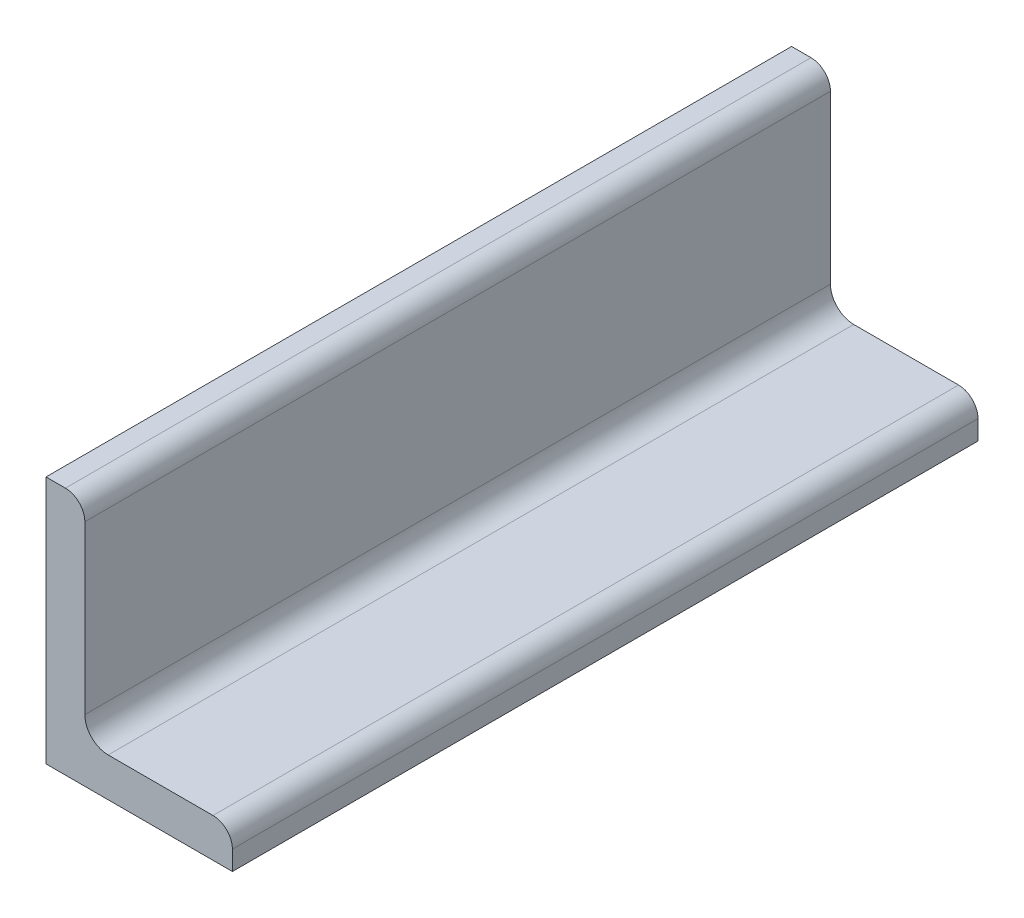
ISO-10303-21;
HEADER;
FILE_DESCRIPTION(('STEP AP214'),'2;1');
FILE_NAME('part.step','',(''),(''),'','','');
FILE_SCHEMA(('AUTOMOTIVE_DESIGN { 1 0 10303 214 1 1 1 1 }'));
ENDSEC;
DATA;
#1=APPLICATION_CONTEXT('core data for automotive mechanical design processes');
#2=APPLICATION_PROTOCOL_DEFINITION('international standard','automotive_design',2000,#1);
#3=PRODUCT_CONTEXT('',#1,'mechanical');
#4=PRODUCT('Part','Part','',(#3));
#5=PRODUCT_RELATED_PRODUCT_CATEGORY('part','',(#4));
#6=PRODUCT_DEFINITION_FORMATION('','',#4);
#7=PRODUCT_DEFINITION_CONTEXT('part definition',#1,'design');
#8=PRODUCT_DEFINITION('design','',#6,#7);
#9=PRODUCT_DEFINITION_SHAPE('','',#8);
#10=(LENGTH_UNIT() NAMED_UNIT(*) SI_UNIT(.MILLI.,.METRE.));
#11=(NAMED_UNIT(*) PLANE_ANGLE_UNIT() SI_UNIT($,.RADIAN.));
#12=(NAMED_UNIT(*) SI_UNIT($,.STERADIAN.) SOLID_ANGLE_UNIT());
#13=UNCERTAINTY_MEASURE_WITH_UNIT(LENGTH_MEASURE(1.E-05),#10,'distance_accuracy_value','');
#14=(GEOMETRIC_REPRESENTATION_CONTEXT(3) GLOBAL_UNCERTAINTY_ASSIGNED_CONTEXT((#13)) GLOBAL_UNIT_ASSIGNED_CONTEXT((#10,
#11,#12)) REPRESENTATION_CONTEXT('',''));
#15=CARTESIAN_POINT('',(0.,0.,0.));
#16=DIRECTION('',(0.,0.,1.));
#17=DIRECTION('',(1.,0.,0.));
#18=AXIS2_PLACEMENT_3D('',#15,#16,#17);
#19=CARTESIAN_POINT('',(0.490776827053332,102.172018782971,304.8));
#20=DIRECTION('',(1.,0.,0.));
#21=DIRECTION('',(0.,0.,-1.));
#22=AXIS2_PLACEMENT_3D('',#19,#20,#21);
#23=PLANE('',#22);
#24=DIRECTION('',(0.,-1.,0.));
#25=VECTOR('',#24,1.);
#26=CARTESIAN_POINT('',(0.490776827053332,102.172018782971,0.));
#27=LINE('',#26,#25);
#28=CARTESIAN_POINT('',(0.490776827053332,102.172018782971,0.));
#29=VERTEX_POINT('',#28);
#30=CARTESIAN_POINT('',(0.490776827053332,0.572018782971054,0.));
#31=VERTEX_POINT('',#30);
#32=EDGE_CURVE('E135',#29,#31,#27,.T.);
#33=ORIENTED_EDGE('',*,*,#32,.T.);
#34=DIRECTION('',(0.,0.,-1.));
#35=VECTOR('',#34,1.);
#36=CARTESIAN_POINT('',(0.490776827053332,0.572018782971054,304.8));
#37=LINE('',#36,#35);
#38=CARTESIAN_POINT('',(0.490776827053332,0.572018782971054,304.8));
#39=VERTEX_POINT('',#38);
#40=EDGE_CURVE('E11',#39,#31,#37,.T.);
#41=ORIENTED_EDGE('',*,*,#40,.F.);
#42=DIRECTION('',(0.,-1.,0.));
#43=VECTOR('',#42,1.);
#44=CARTESIAN_POINT('',(0.490776827053332,102.172018782971,304.8));
#45=LINE('',#44,#43);
#46=CARTESIAN_POINT('',(0.490776827053332,102.172018782971,304.8));
#47=VERTEX_POINT('',#46);
#48=EDGE_CURVE('E151',#47,#39,#45,.T.);
#49=ORIENTED_EDGE('',*,*,#48,.F.);
#50=DIRECTION('',(0.,0.,-1.));
#51=VECTOR('',#50,1.);
#52=CARTESIAN_POINT('',(0.490776827053332,102.172018782971,304.8));
#53=LINE('',#52,#51);
#54=EDGE_CURVE('E131',#47,#29,#53,.T.);
#55=ORIENTED_EDGE('',*,*,#54,.T.);
#56=EDGE_LOOP('',(#33,#41,#49,#55));
#57=FACE_BOUND('',#56,.T.);
#58=ADVANCED_FACE('F33',(#57),#23,.F.);
#59=CARTESIAN_POINT('',(0.490776827053332,0.572018782971054,304.8));
#60=DIRECTION('',(0.,1.,0.));
#61=DIRECTION('',(0.,0.,1.));
#62=AXIS2_PLACEMENT_3D('',#59,#60,#61);
#63=PLANE('',#62);
#64=DIRECTION('',(1.,0.,0.));
#65=VECTOR('',#64,1.);
#66=CARTESIAN_POINT('',(0.490776827053332,0.572018782971054,0.));
#67=LINE('',#66,#65);
#68=CARTESIAN_POINT('',(76.6907768270533,0.572018782971054,0.));
#69=VERTEX_POINT('',#68);
#70=EDGE_CURVE('E138',#31,#69,#67,.T.);
#71=ORIENTED_EDGE('',*,*,#70,.T.);
#72=DIRECTION('',(0.,0.,-1.));
#73=VECTOR('',#72,1.);
#74=CARTESIAN_POINT('',(76.6907768270533,0.572018782971054,304.8));
#75=LINE('',#74,#73);
#76=CARTESIAN_POINT('',(76.6907768270533,0.572018782971054,304.8));
#77=VERTEX_POINT('',#76);
#78=EDGE_CURVE('E41',#77,#69,#75,.T.);
#79=ORIENTED_EDGE('',*,*,#78,.F.);
#80=DIRECTION('',(1.,0.,0.));
#81=VECTOR('',#80,1.);
#82=CARTESIAN_POINT('',(0.490776827053332,0.572018782971054,304.8));
#83=LINE('',#82,#81);
#84=EDGE_CURVE('E95',#39,#77,#83,.T.);
#85=ORIENTED_EDGE('',*,*,#84,.F.);
#86=ORIENTED_EDGE('',*,*,#40,.T.);
#87=EDGE_LOOP('',(#71,#79,#85,#86));
#88=FACE_BOUND('',#87,.T.);
#89=ADVANCED_FACE('F194',(#88),#63,.F.);
#90=CARTESIAN_POINT('',(76.6907768270533,0.572018782971054,304.8));
#91=DIRECTION('',(-1.,0.,0.));
#92=DIRECTION('',(0.,0.,1.));
#93=AXIS2_PLACEMENT_3D('',#90,#91,#92);
#94=PLANE('',#93);
#95=DIRECTION('',(0.,1.,0.));
#96=VECTOR('',#95,1.);
#97=CARTESIAN_POINT('',(76.6907768270533,0.572018782971054,0.));
#98=LINE('',#97,#96);
#99=CARTESIAN_POINT('',(76.6907768270533,8.50951878297105,0.));
#100=VERTEX_POINT('',#99);
#101=EDGE_CURVE('E140',#69,#100,#98,.T.);
#102=ORIENTED_EDGE('',*,*,#101,.T.);
#103=DIRECTION('',(0.,0.,-1.));
#104=VECTOR('',#103,1.);
#105=CARTESIAN_POINT('',(76.6907768270533,8.50951878297105,304.8));
#106=LINE('',#105,#104);
#107=CARTESIAN_POINT('',(76.6907768270533,8.50951878297105,304.8));
#108=VERTEX_POINT('',#107);
#109=EDGE_CURVE('E161',#108,#100,#106,.T.);
#110=ORIENTED_EDGE('',*,*,#109,.F.);
#111=DIRECTION('',(0.,1.,0.));
#112=VECTOR('',#111,1.);
#113=CARTESIAN_POINT('',(76.6907768270533,0.572018782971054,304.8));
#114=LINE('',#113,#112);
#115=EDGE_CURVE('E169',#77,#108,#114,.T.);
#116=ORIENTED_EDGE('',*,*,#115,.F.);
#117=ORIENTED_EDGE('',*,*,#78,.T.);
#118=EDGE_LOOP('',(#102,#110,#116,#117));
#119=FACE_BOUND('',#118,.T.);
#120=ADVANCED_FACE('F167',(#119),#94,.F.);
#121=CARTESIAN_POINT('',(68.7532768270533,8.50951878297105,304.8));
#122=DIRECTION('',(0.,0.,-1.));
#123=DIRECTION('',(-1.,0.,0.));
#124=AXIS2_PLACEMENT_3D('',#121,#122,#123);
#125=CYLINDRICAL_SURFACE('',#124,7.9375);
#126=CARTESIAN_POINT('',(68.7532768270533,8.50951878297105,0.));
#127=DIRECTION('',(0.,0.,1.));
#128=DIRECTION('',(1.,0.,0.));
#129=AXIS2_PLACEMENT_3D('',#126,#127,#128);
#130=CIRCLE('',#129,7.9375);
#131=CARTESIAN_POINT('',(68.7532768270533,16.447018782971,0.));
#132=VERTEX_POINT('',#131);
#133=EDGE_CURVE('E142',#100,#132,#130,.T.);
#134=ORIENTED_EDGE('',*,*,#133,.T.);
#135=DIRECTION('',(0.,0.,-1.));
#136=VECTOR('',#135,1.);
#137=CARTESIAN_POINT('',(68.7532768270533,16.447018782971,304.8));
#138=LINE('',#137,#136);
#139=CARTESIAN_POINT('',(68.7532768270533,16.447018782971,304.8));
#140=VERTEX_POINT('',#139);
#141=EDGE_CURVE('E158',#140,#132,#138,.T.);
#142=ORIENTED_EDGE('',*,*,#141,.F.);
#143=CARTESIAN_POINT('',(68.7532768270533,8.50951878297105,304.8));
#144=DIRECTION('',(0.,0.,1.));
#145=DIRECTION('',(1.,0.,0.));
#146=AXIS2_PLACEMENT_3D('',#143,#144,#145);
#147=CIRCLE('',#146,7.9375);
#148=EDGE_CURVE('E185',#108,#140,#147,.T.);
#149=ORIENTED_EDGE('',*,*,#148,.F.);
#150=ORIENTED_EDGE('',*,*,#109,.T.);
#151=EDGE_LOOP('',(#134,#142,#149,#150));
#152=FACE_BOUND('',#151,.T.);
#153=ADVANCED_FACE('F178',(#152),#125,.T.);
#154=CARTESIAN_POINT('',(68.7532768270533,16.4470187829711,304.8));
#155=DIRECTION('',(0.,-1.,0.));
#156=DIRECTION('',(0.,0.,-1.));
#157=AXIS2_PLACEMENT_3D('',#154,#155,#156);
#158=PLANE('',#157);
#159=DIRECTION('',(-1.,0.,0.));
#160=VECTOR('',#159,1.);
#161=CARTESIAN_POINT('',(68.7532768270533,16.4470187829711,0.));
#162=LINE('',#161,#160);
#163=CARTESIAN_POINT('',(25.8907768270533,16.4470187829711,0.));
#164=VERTEX_POINT('',#163);
#165=EDGE_CURVE('E144',#132,#164,#162,.T.);
#166=ORIENTED_EDGE('',*,*,#165,.T.);
#167=DIRECTION('',(0.,0.,-1.));
#168=VECTOR('',#167,1.);
#169=CARTESIAN_POINT('',(25.8907768270533,16.4470187829711,304.8));
#170=LINE('',#169,#168);
#171=CARTESIAN_POINT('',(25.8907768270533,16.4470187829711,304.8));
#172=VERTEX_POINT('',#171);
#173=EDGE_CURVE('E155',#172,#164,#170,.T.);
#174=ORIENTED_EDGE('',*,*,#173,.F.);
#175=DIRECTION('',(-1.,0.,0.));
#176=VECTOR('',#175,1.);
#177=CARTESIAN_POINT('',(68.7532768270533,16.4470187829711,304.8));
#178=LINE('',#177,#176);
#179=EDGE_CURVE('E184',#140,#172,#178,.T.);
#180=ORIENTED_EDGE('',*,*,#179,.F.);
#181=ORIENTED_EDGE('',*,*,#141,.T.);
#182=EDGE_LOOP('',(#166,#174,#180,#181));
#183=FACE_BOUND('',#182,.T.);
#184=ADVANCED_FACE('F182',(#183),#158,.F.);
#185=CARTESIAN_POINT('',(25.8907768270533,25.972018782971,304.8));
#186=DIRECTION('',(0.,0.,-1.));
#187=DIRECTION('',(-1.,0.,0.));
#188=AXIS2_PLACEMENT_3D('',#185,#186,#187);
#189=CYLINDRICAL_SURFACE('',#188,9.52499999999999);
#190=CARTESIAN_POINT('',(25.8907768270533,25.972018782971,0.));
#191=DIRECTION('',(0.,0.,-1.));
#192=DIRECTION('',(1.,0.,0.));
#193=AXIS2_PLACEMENT_3D('',#190,#191,#192);
#194=CIRCLE('',#193,9.52499999999999);
#195=CARTESIAN_POINT('',(16.3657768270533,25.9720187829711,0.));
#196=VERTEX_POINT('',#195);
#197=EDGE_CURVE('E146',#164,#196,#194,.T.);
#198=ORIENTED_EDGE('',*,*,#197,.T.);
#199=DIRECTION('',(0.,0.,-1.));
#200=VECTOR('',#199,1.);
#201=CARTESIAN_POINT('',(16.3657768270533,25.9720187829711,304.8));
#202=LINE('',#201,#200);
#203=CARTESIAN_POINT('',(16.3657768270533,25.9720187829711,304.8));
#204=VERTEX_POINT('',#203);
#205=EDGE_CURVE('E126',#204,#196,#202,.T.);
#206=ORIENTED_EDGE('',*,*,#205,.F.);
#207=CARTESIAN_POINT('',(25.8907768270533,25.972018782971,304.8));
#208=DIRECTION('',(0.,0.,-1.));
#209=DIRECTION('',(1.,0.,0.));
#210=AXIS2_PLACEMENT_3D('',#207,#208,#209);
#211=CIRCLE('',#210,9.52499999999999);
#212=EDGE_CURVE('E117',#172,#204,#211,.T.);
#213=ORIENTED_EDGE('',*,*,#212,.F.);
#214=ORIENTED_EDGE('',*,*,#173,.T.);
#215=EDGE_LOOP('',(#198,#206,#213,#214));
#216=FACE_BOUND('',#215,.T.);
#217=ADVANCED_FACE('F206',(#216),#189,.F.);
#218=CARTESIAN_POINT('',(16.3657768270533,25.9720187829711,304.8));
#219=DIRECTION('',(-1.,0.,0.));
#220=DIRECTION('',(0.,0.,1.));
#221=AXIS2_PLACEMENT_3D('',#218,#219,#220);
#222=PLANE('',#221);
#223=DIRECTION('',(0.,1.,0.));
#224=VECTOR('',#223,1.);
#225=CARTESIAN_POINT('',(16.3657768270533,25.9720187829711,0.));
#226=LINE('',#225,#224);
#227=CARTESIAN_POINT('',(16.3657768270533,94.2345187829711,0.));
#228=VERTEX_POINT('',#227);
#229=EDGE_CURVE('E125',#196,#228,#226,.T.);
#230=ORIENTED_EDGE('',*,*,#229,.T.);
#231=DIRECTION('',(0.,0.,-1.));
#232=VECTOR('',#231,1.);
#233=CARTESIAN_POINT('',(16.3657768270533,94.2345187829711,304.8));
#234=LINE('',#233,#232);
#235=CARTESIAN_POINT('',(16.3657768270533,94.2345187829711,304.8));
#236=VERTEX_POINT('',#235);
#237=EDGE_CURVE('E122',#236,#228,#234,.T.);
#238=ORIENTED_EDGE('',*,*,#237,.F.);
#239=DIRECTION('',(0.,1.,0.));
#240=VECTOR('',#239,1.);
#241=CARTESIAN_POINT('',(16.3657768270533,25.9720187829711,304.8));
#242=LINE('',#241,#240);
#243=EDGE_CURVE('E111',#204,#236,#242,.T.);
#244=ORIENTED_EDGE('',*,*,#243,.F.);
#245=ORIENTED_EDGE('',*,*,#205,.T.);
#246=EDGE_LOOP('',(#230,#238,#244,#245));
#247=FACE_BOUND('',#246,.T.);
#248=ADVANCED_FACE('F123',(#247),#222,.F.);
#249=CARTESIAN_POINT('',(8.42827682705334,94.234518782971,304.8));
#250=DIRECTION('',(0.,0.,-1.));
#251=DIRECTION('',(-1.,0.,0.));
#252=AXIS2_PLACEMENT_3D('',#249,#250,#251);
#253=CYLINDRICAL_SURFACE('',#252,7.9375);
#254=CARTESIAN_POINT('',(8.42827682705334,94.234518782971,0.));
#255=DIRECTION('',(0.,0.,1.));
#256=DIRECTION('',(1.,0.,0.));
#257=AXIS2_PLACEMENT_3D('',#254,#255,#256);
#258=CIRCLE('',#257,7.9375);
#259=CARTESIAN_POINT('',(8.42827682705333,102.172018782971,0.));
#260=VERTEX_POINT('',#259);
#261=EDGE_CURVE('E81',#228,#260,#258,.T.);
#262=ORIENTED_EDGE('',*,*,#261,.T.);
#263=DIRECTION('',(0.,0.,-1.));
#264=VECTOR('',#263,1.);
#265=CARTESIAN_POINT('',(8.42827682705333,102.172018782971,304.8));
#266=LINE('',#265,#264);
#267=CARTESIAN_POINT('',(8.42827682705333,102.172018782971,304.8));
#268=VERTEX_POINT('',#267);
#269=EDGE_CURVE('E127',#268,#260,#266,.T.);
#270=ORIENTED_EDGE('',*,*,#269,.F.);
#271=CARTESIAN_POINT('',(8.42827682705334,94.234518782971,304.8));
#272=DIRECTION('',(0.,0.,1.));
#273=DIRECTION('',(1.,0.,0.));
#274=AXIS2_PLACEMENT_3D('',#271,#272,#273);
#275=CIRCLE('',#274,7.9375);
#276=EDGE_CURVE('E115',#236,#268,#275,.T.);
#277=ORIENTED_EDGE('',*,*,#276,.F.);
#278=ORIENTED_EDGE('',*,*,#237,.T.);
#279=EDGE_LOOP('',(#262,#270,#277,#278));
#280=FACE_BOUND('',#279,.T.);
#281=ADVANCED_FACE('F129',(#280),#253,.T.);
#282=CARTESIAN_POINT('',(8.42827682705333,102.172018782971,304.8));
#283=DIRECTION('',(0.,-1.,0.));
#284=DIRECTION('',(0.,0.,-1.));
#285=AXIS2_PLACEMENT_3D('',#282,#283,#284);
#286=PLANE('',#285);
#287=DIRECTION('',(-1.,0.,0.));
#288=VECTOR('',#287,1.);
#289=CARTESIAN_POINT('',(8.42827682705333,102.172018782971,0.));
#290=LINE('',#289,#288);
#291=EDGE_CURVE('E87',#260,#29,#290,.T.);
#292=ORIENTED_EDGE('',*,*,#291,.T.);
#293=ORIENTED_EDGE('',*,*,#54,.F.);
#294=DIRECTION('',(-1.,0.,0.));
#295=VECTOR('',#294,1.);
#296=CARTESIAN_POINT('',(8.42827682705333,102.172018782971,304.8));
#297=LINE('',#296,#295);
#298=EDGE_CURVE('E49',#268,#47,#297,.T.);
#299=ORIENTED_EDGE('',*,*,#298,.F.);
#300=ORIENTED_EDGE('',*,*,#269,.T.);
#301=EDGE_LOOP('',(#292,#293,#299,#300));
#302=FACE_BOUND('',#301,.T.);
#303=ADVANCED_FACE('F214',(#302),#286,.F.);
#304=CARTESIAN_POINT('',(68.7532768270533,8.50951878297105,304.8));
#305=DIRECTION('',(0.,0.,1.));
#306=DIRECTION('',(1.,0.,0.));
#307=AXIS2_PLACEMENT_3D('',#304,#305,#306);
#308=PLANE('',#307);
#309=ORIENTED_EDGE('',*,*,#48,.T.);
#310=ORIENTED_EDGE('',*,*,#84,.T.);
#311=ORIENTED_EDGE('',*,*,#115,.T.);
#312=ORIENTED_EDGE('',*,*,#148,.T.);
#313=ORIENTED_EDGE('',*,*,#179,.T.);
#314=ORIENTED_EDGE('',*,*,#212,.T.);
#315=ORIENTED_EDGE('',*,*,#243,.T.);
#316=ORIENTED_EDGE('',*,*,#276,.T.);
#317=ORIENTED_EDGE('',*,*,#298,.T.);
#318=EDGE_LOOP('',(#309,#310,#311,#312,#313,#314,#315,#316,#317));
#319=FACE_BOUND('',#318,.T.);
#320=ADVANCED_FACE('F113',(#319),#308,.T.);
#321=CARTESIAN_POINT('',(68.7532768270533,8.50951878297105,0.));
#322=DIRECTION('',(0.,0.,1.));
#323=DIRECTION('',(1.,0.,0.));
#324=AXIS2_PLACEMENT_3D('',#321,#322,#323);
#325=PLANE('',#324);
#326=ORIENTED_EDGE('',*,*,#32,.F.);
#327=ORIENTED_EDGE('',*,*,#291,.F.);
#328=ORIENTED_EDGE('',*,*,#261,.F.);
#329=ORIENTED_EDGE('',*,*,#229,.F.);
#330=ORIENTED_EDGE('',*,*,#197,.F.);
#331=ORIENTED_EDGE('',*,*,#165,.F.);
#332=ORIENTED_EDGE('',*,*,#133,.F.);
#333=ORIENTED_EDGE('',*,*,#101,.F.);
#334=ORIENTED_EDGE('',*,*,#70,.F.);
#335=EDGE_LOOP('',(#326,#327,#328,#329,#330,#331,#332,#333,#334));
#336=FACE_BOUND('',#335,.T.);
#337=ADVANCED_FACE('F173',(#336),#325,.F.);
#338=CLOSED_SHELL('',(#58,#89,#120,#153,#184,#217,#248,#281,#303,#320,#337));
#339=MANIFOLD_SOLID_BREP('B2',#338);
#340=ADVANCED_BREP_SHAPE_REPRESENTATION('',(#18,#339),#14);
#341=SHAPE_DEFINITION_REPRESENTATION(#9,#340);
ENDSEC;
END-ISO-10303-21;
